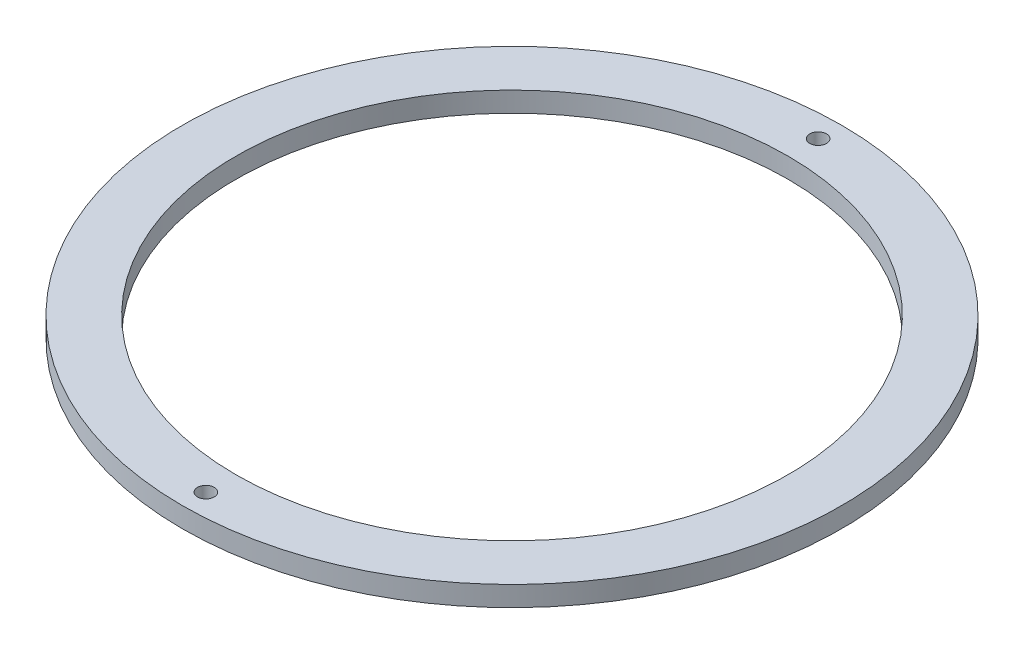
ISO-10303-21;
HEADER;
FILE_DESCRIPTION(('STEP AP214'),'2;1');
FILE_NAME('part.step','',(''),(''),'','','');
FILE_SCHEMA(('AUTOMOTIVE_DESIGN { 1 0 10303 214 1 1 1 1 }'));
ENDSEC;
DATA;
#1=APPLICATION_CONTEXT('core data for automotive mechanical design processes');
#2=APPLICATION_PROTOCOL_DEFINITION('international standard','automotive_design',2000,#1);
#3=PRODUCT_CONTEXT('',#1,'mechanical');
#4=PRODUCT('Part','Part','',(#3));
#5=PRODUCT_RELATED_PRODUCT_CATEGORY('part','',(#4));
#6=PRODUCT_DEFINITION_FORMATION('','',#4);
#7=PRODUCT_DEFINITION_CONTEXT('part definition',#1,'design');
#8=PRODUCT_DEFINITION('design','',#6,#7);
#9=PRODUCT_DEFINITION_SHAPE('','',#8);
#10=(LENGTH_UNIT() NAMED_UNIT(*) SI_UNIT(.MILLI.,.METRE.));
#11=(NAMED_UNIT(*) PLANE_ANGLE_UNIT() SI_UNIT($,.RADIAN.));
#12=(NAMED_UNIT(*) SI_UNIT($,.STERADIAN.) SOLID_ANGLE_UNIT());
#13=UNCERTAINTY_MEASURE_WITH_UNIT(LENGTH_MEASURE(1.E-05),#10,'distance_accuracy_value','');
#14=(GEOMETRIC_REPRESENTATION_CONTEXT(3) GLOBAL_UNCERTAINTY_ASSIGNED_CONTEXT((#13)) GLOBAL_UNIT_ASSIGNED_CONTEXT((#10,
#11,#12)) REPRESENTATION_CONTEXT('',''));
#15=CARTESIAN_POINT('',(0.,0.,0.));
#16=DIRECTION('',(0.,0.,1.));
#17=DIRECTION('',(1.,0.,0.));
#18=AXIS2_PLACEMENT_3D('',#15,#16,#17);
#19=CARTESIAN_POINT('',(2.13984649754628E-12,3.,2.05618428489412E-13));
#20=DIRECTION('',(0.,1.,0.));
#21=DIRECTION('',(0.,0.,1.));
#22=AXIS2_PLACEMENT_3D('',#19,#20,#21);
#23=PLANE('',#22);
#24=CARTESIAN_POINT('',(0.,3.,-45.7500000000079));
#25=DIRECTION('',(0.,1.,0.));
#26=DIRECTION('',(0.,0.,1.));
#27=AXIS2_PLACEMENT_3D('',#24,#25,#26);
#28=CIRCLE('',#27,1.24999999999999);
#29=CARTESIAN_POINT('',(0.,3.,-44.5000000000079));
#30=VERTEX_POINT('',#29);
#31=EDGE_CURVE('E74',#30,#30,#28,.T.);
#32=ORIENTED_EDGE('',*,*,#31,.F.);
#33=EDGE_LOOP('',(#32));
#34=FACE_BOUND('',#33,.T.);
#35=CARTESIAN_POINT('',(0.,3.,45.7500000000008));
#36=DIRECTION('',(0.,1.,0.));
#37=DIRECTION('',(0.,0.,1.));
#38=AXIS2_PLACEMENT_3D('',#35,#36,#37);
#39=CIRCLE('',#38,1.24999999999999);
#40=CARTESIAN_POINT('',(0.,3.,47.0000000000008));
#41=VERTEX_POINT('',#40);
#42=EDGE_CURVE('E70',#41,#41,#39,.T.);
#43=ORIENTED_EDGE('',*,*,#42,.F.);
#44=EDGE_LOOP('',(#43));
#45=FACE_BOUND('',#44,.T.);
#46=CARTESIAN_POINT('',(2.13984649754628E-12,3.,2.05618428489412E-13));
#47=DIRECTION('',(0.,1.,0.));
#48=DIRECTION('',(0.,0.,1.));
#49=AXIS2_PLACEMENT_3D('',#46,#47,#48);
#50=CIRCLE('',#49,49.25);
#51=CARTESIAN_POINT('',(2.13984649754628E-12,3.,49.2500000000002));
#52=VERTEX_POINT('',#51);
#53=EDGE_CURVE('E10',#52,#52,#50,.T.);
#54=ORIENTED_EDGE('',*,*,#53,.T.);
#55=EDGE_LOOP('',(#54));
#56=FACE_BOUND('',#55,.T.);
#57=CARTESIAN_POINT('',(2.13984649754628E-12,3.,2.05618428489412E-13));
#58=DIRECTION('',(0.,1.,0.));
#59=DIRECTION('',(0.,0.,1.));
#60=AXIS2_PLACEMENT_3D('',#57,#58,#59);
#61=CIRCLE('',#60,41.25);
#62=CARTESIAN_POINT('',(2.13984649754628E-12,3.,41.2500000000002));
#63=VERTEX_POINT('',#62);
#64=EDGE_CURVE('E56',#63,#63,#61,.T.);
#65=ORIENTED_EDGE('',*,*,#64,.F.);
#66=EDGE_LOOP('',(#65));
#67=FACE_BOUND('',#66,.T.);
#68=ADVANCED_FACE('F43',(#34,#45,#56,#67),#23,.T.);
#69=CARTESIAN_POINT('',(2.13984649754628E-12,0.,2.05618428489412E-13));
#70=DIRECTION('',(0.,1.,0.));
#71=DIRECTION('',(0.,0.,1.));
#72=AXIS2_PLACEMENT_3D('',#69,#70,#71);
#73=PLANE('',#72);
#74=CARTESIAN_POINT('',(0.,0.,-45.7500000000079));
#75=DIRECTION('',(0.,1.,0.));
#76=DIRECTION('',(0.,0.,1.));
#77=AXIS2_PLACEMENT_3D('',#74,#75,#76);
#78=CIRCLE('',#77,1.24999999999999);
#79=CARTESIAN_POINT('',(0.,0.,-44.5000000000079));
#80=VERTEX_POINT('',#79);
#81=EDGE_CURVE('E62',#80,#80,#78,.T.);
#82=ORIENTED_EDGE('',*,*,#81,.T.);
#83=EDGE_LOOP('',(#82));
#84=FACE_BOUND('',#83,.T.);
#85=CARTESIAN_POINT('',(0.,0.,45.7500000000008));
#86=DIRECTION('',(0.,1.,0.));
#87=DIRECTION('',(0.,0.,1.));
#88=AXIS2_PLACEMENT_3D('',#85,#86,#87);
#89=CIRCLE('',#88,1.24999999999999);
#90=CARTESIAN_POINT('',(0.,0.,47.0000000000008));
#91=VERTEX_POINT('',#90);
#92=EDGE_CURVE('E66',#91,#91,#89,.T.);
#93=ORIENTED_EDGE('',*,*,#92,.T.);
#94=EDGE_LOOP('',(#93));
#95=FACE_BOUND('',#94,.T.);
#96=CARTESIAN_POINT('',(2.13984649754628E-12,0.,2.05618428489412E-13));
#97=DIRECTION('',(0.,1.,0.));
#98=DIRECTION('',(0.,0.,1.));
#99=AXIS2_PLACEMENT_3D('',#96,#97,#98);
#100=CIRCLE('',#99,49.25);
#101=CARTESIAN_POINT('',(2.13984649754628E-12,0.,49.2500000000002));
#102=VERTEX_POINT('',#101);
#103=EDGE_CURVE('E47',#102,#102,#100,.T.);
#104=ORIENTED_EDGE('',*,*,#103,.F.);
#105=EDGE_LOOP('',(#104));
#106=FACE_BOUND('',#105,.T.);
#107=CARTESIAN_POINT('',(2.13984649754628E-12,0.,2.05618428489412E-13));
#108=DIRECTION('',(0.,1.,0.));
#109=DIRECTION('',(0.,0.,1.));
#110=AXIS2_PLACEMENT_3D('',#107,#108,#109);
#111=CIRCLE('',#110,41.25);
#112=CARTESIAN_POINT('',(2.13984649754628E-12,0.,41.2500000000002));
#113=VERTEX_POINT('',#112);
#114=EDGE_CURVE('E58',#113,#113,#111,.T.);
#115=ORIENTED_EDGE('',*,*,#114,.T.);
#116=EDGE_LOOP('',(#115));
#117=FACE_BOUND('',#116,.T.);
#118=ADVANCED_FACE('F82',(#84,#95,#106,#117),#73,.F.);
#119=CARTESIAN_POINT('',(2.13984649754628E-12,3.,2.05618428489412E-13));
#120=DIRECTION('',(0.,-1.,0.));
#121=DIRECTION('',(0.,0.,-1.));
#122=AXIS2_PLACEMENT_3D('',#119,#120,#121);
#123=CYLINDRICAL_SURFACE('',#122,49.25);
#124=ORIENTED_EDGE('',*,*,#53,.F.);
#125=EDGE_LOOP('',(#124));
#126=FACE_BOUND('',#125,.T.);
#127=ORIENTED_EDGE('',*,*,#103,.T.);
#128=EDGE_LOOP('',(#127));
#129=FACE_BOUND('',#128,.T.);
#130=ADVANCED_FACE('F45',(#126,#129),#123,.T.);
#131=CARTESIAN_POINT('',(2.13984649754628E-12,3.,2.05618428489412E-13));
#132=DIRECTION('',(0.,-1.,0.));
#133=DIRECTION('',(0.,0.,-1.));
#134=AXIS2_PLACEMENT_3D('',#131,#132,#133);
#135=CYLINDRICAL_SURFACE('',#134,41.25);
#136=ORIENTED_EDGE('',*,*,#64,.T.);
#137=EDGE_LOOP('',(#136));
#138=FACE_BOUND('',#137,.T.);
#139=ORIENTED_EDGE('',*,*,#114,.F.);
#140=EDGE_LOOP('',(#139));
#141=FACE_BOUND('',#140,.T.);
#142=ADVANCED_FACE('F99',(#138,#141),#135,.F.);
#143=CARTESIAN_POINT('',(0.,0.,45.7500000000008));
#144=DIRECTION('',(0.,1.,0.));
#145=DIRECTION('',(0.,0.,1.));
#146=AXIS2_PLACEMENT_3D('',#143,#144,#145);
#147=CYLINDRICAL_SURFACE('',#146,1.24999999999999);
#148=ORIENTED_EDGE('',*,*,#92,.F.);
#149=EDGE_LOOP('',(#148));
#150=FACE_BOUND('',#149,.T.);
#151=ORIENTED_EDGE('',*,*,#42,.T.);
#152=EDGE_LOOP('',(#151));
#153=FACE_BOUND('',#152,.T.);
#154=ADVANCED_FACE('F88',(#150,#153),#147,.F.);
#155=CARTESIAN_POINT('',(0.,0.,-45.7500000000079));
#156=DIRECTION('',(0.,1.,0.));
#157=DIRECTION('',(0.,0.,1.));
#158=AXIS2_PLACEMENT_3D('',#155,#156,#157);
#159=CYLINDRICAL_SURFACE('',#158,1.24999999999999);
#160=ORIENTED_EDGE('',*,*,#81,.F.);
#161=EDGE_LOOP('',(#160));
#162=FACE_BOUND('',#161,.T.);
#163=ORIENTED_EDGE('',*,*,#31,.T.);
#164=EDGE_LOOP('',(#163));
#165=FACE_BOUND('',#164,.T.);
#166=ADVANCED_FACE('F85',(#162,#165),#159,.F.);
#167=CLOSED_SHELL('',(#68,#118,#130,#142,#154,#166));
#168=MANIFOLD_SOLID_BREP('B2',#167);
#169=ADVANCED_BREP_SHAPE_REPRESENTATION('',(#18,#168),#14);
#170=SHAPE_DEFINITION_REPRESENTATION(#9,#169);
ENDSEC;
END-ISO-10303-21;
